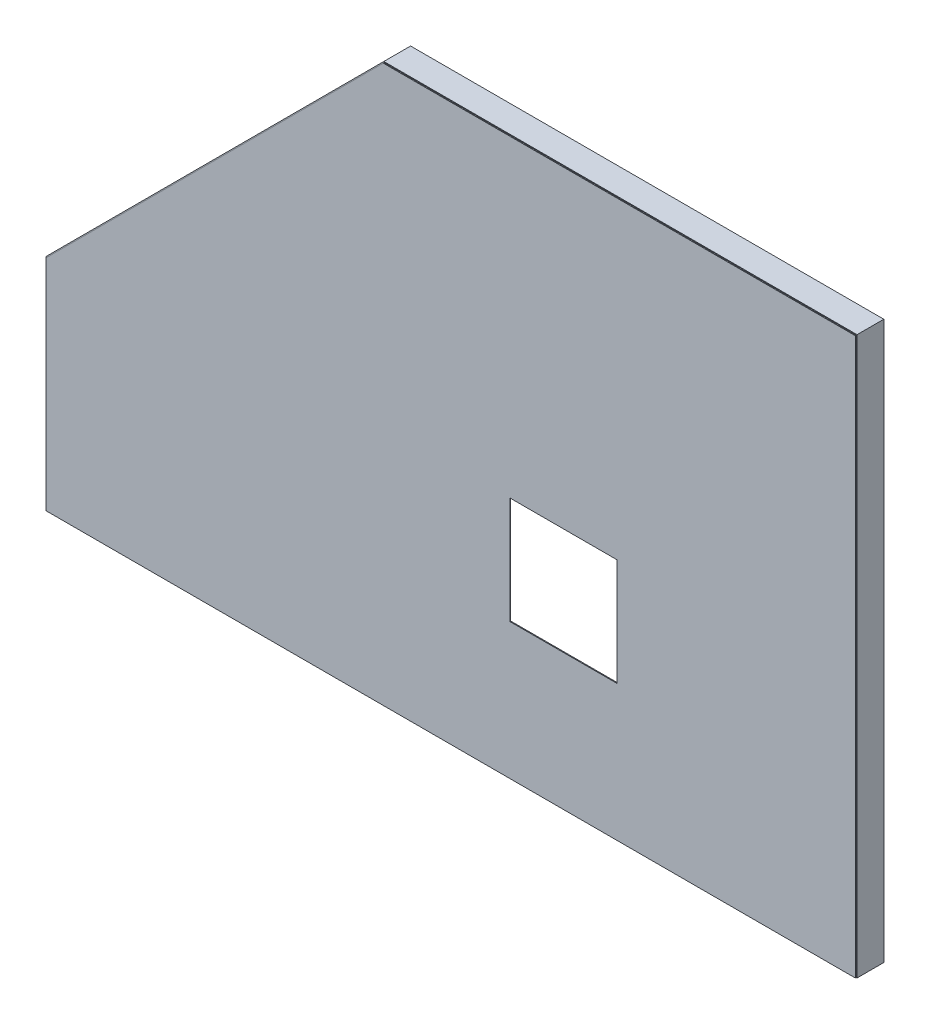
ISO-10303-21;
HEADER;
FILE_DESCRIPTION(('STEP AP214'),'2;1');
FILE_NAME('part.step','',(''),(''),'','','');
FILE_SCHEMA(('AUTOMOTIVE_DESIGN { 1 0 10303 214 1 1 1 1 }'));
ENDSEC;
DATA;
#1=APPLICATION_CONTEXT('core data for automotive mechanical design processes');
#2=APPLICATION_PROTOCOL_DEFINITION('international standard','automotive_design',2000,#1);
#3=PRODUCT_CONTEXT('',#1,'mechanical');
#4=PRODUCT('Part','Part','',(#3));
#5=PRODUCT_RELATED_PRODUCT_CATEGORY('part','',(#4));
#6=PRODUCT_DEFINITION_FORMATION('','',#4);
#7=PRODUCT_DEFINITION_CONTEXT('part definition',#1,'design');
#8=PRODUCT_DEFINITION('design','',#6,#7);
#9=PRODUCT_DEFINITION_SHAPE('','',#8);
#10=(LENGTH_UNIT() NAMED_UNIT(*) SI_UNIT(.MILLI.,.METRE.));
#11=(NAMED_UNIT(*) PLANE_ANGLE_UNIT() SI_UNIT($,.RADIAN.));
#12=(NAMED_UNIT(*) SI_UNIT($,.STERADIAN.) SOLID_ANGLE_UNIT());
#13=UNCERTAINTY_MEASURE_WITH_UNIT(LENGTH_MEASURE(1.E-05),#10,'distance_accuracy_value','');
#14=(GEOMETRIC_REPRESENTATION_CONTEXT(3) GLOBAL_UNCERTAINTY_ASSIGNED_CONTEXT((#13)) GLOBAL_UNIT_ASSIGNED_CONTEXT((#10,
#11,#12)) REPRESENTATION_CONTEXT('',''));
#15=CARTESIAN_POINT('',(0.,0.,0.));
#16=DIRECTION('',(0.,0.,1.));
#17=DIRECTION('',(1.,0.,0.));
#18=AXIS2_PLACEMENT_3D('',#15,#16,#17);
#19=CARTESIAN_POINT('',(0.,0.,-25.4));
#20=DIRECTION('',(-1.,0.,0.));
#21=DIRECTION('',(0.,-1.,0.));
#22=AXIS2_PLACEMENT_3D('',#19,#20,#21);
#23=PLANE('',#22);
#24=DIRECTION('',(0.,-1.,0.));
#25=VECTOR('',#24,1.);
#26=CARTESIAN_POINT('',(0.,0.,0.));
#27=LINE('',#26,#25);
#28=CARTESIAN_POINT('',(0.,208.,0.));
#29=VERTEX_POINT('',#28);
#30=CARTESIAN_POINT('',(0.,0.,0.));
#31=VERTEX_POINT('',#30);
#32=EDGE_CURVE('E160',#29,#31,#27,.T.);
#33=ORIENTED_EDGE('',*,*,#32,.T.);
#34=DIRECTION('',(0.,0.,1.));
#35=VECTOR('',#34,1.);
#36=CARTESIAN_POINT('',(0.,0.,-25.4));
#37=LINE('',#36,#35);
#38=CARTESIAN_POINT('',(0.,0.,-25.4));
#39=VERTEX_POINT('',#38);
#40=EDGE_CURVE('E12',#39,#31,#37,.T.);
#41=ORIENTED_EDGE('',*,*,#40,.F.);
#42=DIRECTION('',(0.,-1.,0.));
#43=VECTOR('',#42,1.);
#44=CARTESIAN_POINT('',(0.,0.,-25.4));
#45=LINE('',#44,#43);
#46=CARTESIAN_POINT('',(0.,208.,-25.4));
#47=VERTEX_POINT('',#46);
#48=EDGE_CURVE('E178',#47,#39,#45,.T.);
#49=ORIENTED_EDGE('',*,*,#48,.F.);
#50=DIRECTION('',(0.,0.,1.));
#51=VECTOR('',#50,1.);
#52=CARTESIAN_POINT('',(0.,208.,-25.4));
#53=LINE('',#52,#51);
#54=EDGE_CURVE('E156',#47,#29,#53,.T.);
#55=ORIENTED_EDGE('',*,*,#54,.T.);
#56=EDGE_LOOP('',(#33,#41,#49,#55));
#57=FACE_BOUND('',#56,.T.);
#58=ADVANCED_FACE('F52',(#57),#23,.F.);
#59=CARTESIAN_POINT('',(-0.83566,0.,-25.4));
#60=DIRECTION('',(0.,1.,0.));
#61=DIRECTION('',(0.,0.,1.));
#62=AXIS2_PLACEMENT_3D('',#59,#60,#61);
#63=PLANE('',#62);
#64=DIRECTION('',(-1.,0.,0.));
#65=VECTOR('',#64,1.);
#66=CARTESIAN_POINT('',(-0.83566,0.,0.));
#67=LINE('',#66,#65);
#68=CARTESIAN_POINT('',(-0.83566,0.,0.));
#69=VERTEX_POINT('',#68);
#70=EDGE_CURVE('E163',#31,#69,#67,.T.);
#71=ORIENTED_EDGE('',*,*,#70,.T.);
#72=DIRECTION('',(0.,0.,1.));
#73=VECTOR('',#72,1.);
#74=CARTESIAN_POINT('',(-0.83566,0.,-25.4));
#75=LINE('',#74,#73);
#76=CARTESIAN_POINT('',(-0.83566,0.,-25.4));
#77=VERTEX_POINT('',#76);
#78=EDGE_CURVE('E60',#77,#69,#75,.T.);
#79=ORIENTED_EDGE('',*,*,#78,.F.);
#80=DIRECTION('',(-1.,0.,0.));
#81=VECTOR('',#80,1.);
#82=CARTESIAN_POINT('',(-0.83566,0.,-25.4));
#83=LINE('',#82,#81);
#84=EDGE_CURVE('E117',#39,#77,#83,.T.);
#85=ORIENTED_EDGE('',*,*,#84,.F.);
#86=ORIENTED_EDGE('',*,*,#40,.T.);
#87=EDGE_LOOP('',(#71,#79,#85,#86));
#88=FACE_BOUND('',#87,.T.);
#89=ADVANCED_FACE('F227',(#88),#63,.F.);
#90=CARTESIAN_POINT('',(-0.83566,0.,-25.4));
#91=DIRECTION('',(1.,0.,0.));
#92=DIRECTION('',(0.,1.,0.));
#93=AXIS2_PLACEMENT_3D('',#90,#91,#92);
#94=PLANE('',#93);
#95=DIRECTION('',(0.,1.,0.));
#96=VECTOR('',#95,1.);
#97=CARTESIAN_POINT('',(-0.83566,0.,0.));
#98=LINE('',#97,#96);
#99=CARTESIAN_POINT('',(-0.83566,208.346141705533,0.));
#100=VERTEX_POINT('',#99);
#101=EDGE_CURVE('E165',#69,#100,#98,.T.);
#102=ORIENTED_EDGE('',*,*,#101,.T.);
#103=DIRECTION('',(0.,0.,1.));
#104=VECTOR('',#103,1.);
#105=CARTESIAN_POINT('',(-0.83566,208.346141705533,-25.4));
#106=LINE('',#105,#104);
#107=CARTESIAN_POINT('',(-0.83566,208.346141705533,-25.4));
#108=VERTEX_POINT('',#107);
#109=EDGE_CURVE('E191',#108,#100,#106,.T.);
#110=ORIENTED_EDGE('',*,*,#109,.F.);
#111=DIRECTION('',(0.,1.,0.));
#112=VECTOR('',#111,1.);
#113=CARTESIAN_POINT('',(-0.83566,0.,-25.4));
#114=LINE('',#113,#112);
#115=EDGE_CURVE('E199',#77,#108,#114,.T.);
#116=ORIENTED_EDGE('',*,*,#115,.F.);
#117=ORIENTED_EDGE('',*,*,#78,.T.);
#118=EDGE_LOOP('',(#102,#110,#116,#117));
#119=FACE_BOUND('',#118,.T.);
#120=ADVANCED_FACE('F197',(#119),#94,.F.);
#121=CARTESIAN_POINT('',(-0.83566,208.346141705533,-25.4));
#122=DIRECTION('',(0.707106781186548,-0.707106781186547,0.));
#123=DIRECTION('',(0.707106781186547,0.707106781186548,0.));
#124=AXIS2_PLACEMENT_3D('',#121,#122,#123);
#125=PLANE('',#124);
#126=DIRECTION('',(0.707106781186547,0.707106781186548,0.));
#127=VECTOR('',#126,1.);
#128=CARTESIAN_POINT('',(-0.83566,208.346141705533,0.));
#129=LINE('',#128,#127);
#130=CARTESIAN_POINT('',(319.653858294467,528.83566,0.));
#131=VERTEX_POINT('',#130);
#132=EDGE_CURVE('E167',#100,#131,#129,.T.);
#133=ORIENTED_EDGE('',*,*,#132,.T.);
#134=DIRECTION('',(0.,0.,1.));
#135=VECTOR('',#134,1.);
#136=CARTESIAN_POINT('',(319.653858294467,528.83566,-25.4));
#137=LINE('',#136,#135);
#138=CARTESIAN_POINT('',(319.653858294467,528.83566,-25.4));
#139=VERTEX_POINT('',#138);
#140=EDGE_CURVE('E188',#139,#131,#137,.T.);
#141=ORIENTED_EDGE('',*,*,#140,.F.);
#142=DIRECTION('',(0.707106781186547,0.707106781186548,0.));
#143=VECTOR('',#142,1.);
#144=CARTESIAN_POINT('',(-0.83566,208.346141705533,-25.4));
#145=LINE('',#144,#143);
#146=EDGE_CURVE('E217',#108,#139,#145,.T.);
#147=ORIENTED_EDGE('',*,*,#146,.F.);
#148=ORIENTED_EDGE('',*,*,#109,.T.);
#149=EDGE_LOOP('',(#133,#141,#147,#148));
#150=FACE_BOUND('',#149,.T.);
#151=ADVANCED_FACE('F208',(#150),#125,.F.);
#152=CARTESIAN_POINT('',(319.653858294467,528.83566,-25.4));
#153=DIRECTION('',(0.,-1.,0.));
#154=DIRECTION('',(1.,0.,0.));
#155=AXIS2_PLACEMENT_3D('',#152,#153,#154);
#156=PLANE('',#155);
#157=DIRECTION('',(1.,0.,0.));
#158=VECTOR('',#157,1.);
#159=CARTESIAN_POINT('',(319.653858294467,528.83566,0.));
#160=LINE('',#159,#158);
#161=CARTESIAN_POINT('',(768.83566,528.83566,0.));
#162=VERTEX_POINT('',#161);
#163=EDGE_CURVE('E169',#131,#162,#160,.T.);
#164=ORIENTED_EDGE('',*,*,#163,.T.);
#165=DIRECTION('',(0.,0.,1.));
#166=VECTOR('',#165,1.);
#167=CARTESIAN_POINT('',(768.83566,528.83566,-25.4));
#168=LINE('',#167,#166);
#169=CARTESIAN_POINT('',(768.83566,528.83566,-25.4));
#170=VERTEX_POINT('',#169);
#171=EDGE_CURVE('E185',#170,#162,#168,.T.);
#172=ORIENTED_EDGE('',*,*,#171,.F.);
#173=DIRECTION('',(1.,0.,0.));
#174=VECTOR('',#173,1.);
#175=CARTESIAN_POINT('',(319.653858294467,528.83566,-25.4));
#176=LINE('',#175,#174);
#177=EDGE_CURVE('E214',#139,#170,#176,.T.);
#178=ORIENTED_EDGE('',*,*,#177,.F.);
#179=ORIENTED_EDGE('',*,*,#140,.T.);
#180=EDGE_LOOP('',(#164,#172,#178,#179));
#181=FACE_BOUND('',#180,.T.);
#182=ADVANCED_FACE('F212',(#181),#156,.F.);
#183=CARTESIAN_POINT('',(768.83566,528.83566,-25.4));
#184=DIRECTION('',(-1.,0.,0.));
#185=DIRECTION('',(0.,-1.,0.));
#186=AXIS2_PLACEMENT_3D('',#183,#184,#185);
#187=PLANE('',#186);
#188=DIRECTION('',(0.,-1.,0.));
#189=VECTOR('',#188,1.);
#190=CARTESIAN_POINT('',(768.83566,528.83566,0.));
#191=LINE('',#190,#189);
#192=CARTESIAN_POINT('',(768.83566,0.,0.));
#193=VERTEX_POINT('',#192);
#194=EDGE_CURVE('E171',#162,#193,#191,.T.);
#195=ORIENTED_EDGE('',*,*,#194,.T.);
#196=DIRECTION('',(0.,0.,1.));
#197=VECTOR('',#196,1.);
#198=CARTESIAN_POINT('',(768.83566,0.,-25.4));
#199=LINE('',#198,#197);
#200=CARTESIAN_POINT('',(768.83566,0.,-25.4));
#201=VERTEX_POINT('',#200);
#202=EDGE_CURVE('E182',#201,#193,#199,.T.);
#203=ORIENTED_EDGE('',*,*,#202,.F.);
#204=DIRECTION('',(0.,-1.,0.));
#205=VECTOR('',#204,1.);
#206=CARTESIAN_POINT('',(768.83566,528.83566,-25.4));
#207=LINE('',#206,#205);
#208=EDGE_CURVE('E216',#170,#201,#207,.T.);
#209=ORIENTED_EDGE('',*,*,#208,.F.);
#210=ORIENTED_EDGE('',*,*,#171,.T.);
#211=EDGE_LOOP('',(#195,#203,#209,#210));
#212=FACE_BOUND('',#211,.T.);
#213=ADVANCED_FACE('F239',(#212),#187,.F.);
#214=CARTESIAN_POINT('',(768.83566,0.,-25.4));
#215=DIRECTION('',(0.,1.,0.));
#216=DIRECTION('',(-1.,0.,0.));
#217=AXIS2_PLACEMENT_3D('',#214,#215,#216);
#218=PLANE('',#217);
#219=DIRECTION('',(-1.,0.,0.));
#220=VECTOR('',#219,1.);
#221=CARTESIAN_POINT('',(768.83566,0.,0.));
#222=LINE('',#221,#220);
#223=CARTESIAN_POINT('',(768.,0.,0.));
#224=VERTEX_POINT('',#223);
#225=EDGE_CURVE('E173',#193,#224,#222,.T.);
#226=ORIENTED_EDGE('',*,*,#225,.T.);
#227=DIRECTION('',(0.,0.,1.));
#228=VECTOR('',#227,1.);
#229=CARTESIAN_POINT('',(768.,0.,-25.4));
#230=LINE('',#229,#228);
#231=CARTESIAN_POINT('',(768.,0.,-25.4));
#232=VERTEX_POINT('',#231);
#233=EDGE_CURVE('E151',#232,#224,#230,.T.);
#234=ORIENTED_EDGE('',*,*,#233,.F.);
#235=DIRECTION('',(-1.,0.,0.));
#236=VECTOR('',#235,1.);
#237=CARTESIAN_POINT('',(768.83566,0.,-25.4));
#238=LINE('',#237,#236);
#239=EDGE_CURVE('E142',#201,#232,#238,.T.);
#240=ORIENTED_EDGE('',*,*,#239,.F.);
#241=ORIENTED_EDGE('',*,*,#202,.T.);
#242=EDGE_LOOP('',(#226,#234,#240,#241));
#243=FACE_BOUND('',#242,.T.);
#244=ADVANCED_FACE('F242',(#243),#218,.F.);
#245=CARTESIAN_POINT('',(768.,528.,-25.4));
#246=DIRECTION('',(1.,0.,0.));
#247=DIRECTION('',(0.,0.,-1.));
#248=AXIS2_PLACEMENT_3D('',#245,#246,#247);
#249=PLANE('',#248);
#250=DIRECTION('',(0.,1.,0.));
#251=VECTOR('',#250,1.);
#252=CARTESIAN_POINT('',(768.,528.,0.));
#253=LINE('',#252,#251);
#254=CARTESIAN_POINT('',(768.,528.,0.));
#255=VERTEX_POINT('',#254);
#256=EDGE_CURVE('E150',#224,#255,#253,.T.);
#257=ORIENTED_EDGE('',*,*,#256,.T.);
#258=DIRECTION('',(0.,0.,1.));
#259=VECTOR('',#258,1.);
#260=CARTESIAN_POINT('',(768.,528.,-25.4));
#261=LINE('',#260,#259);
#262=CARTESIAN_POINT('',(768.,528.,-25.4));
#263=VERTEX_POINT('',#262);
#264=EDGE_CURVE('E147',#263,#255,#261,.T.);
#265=ORIENTED_EDGE('',*,*,#264,.F.);
#266=DIRECTION('',(0.,1.,0.));
#267=VECTOR('',#266,1.);
#268=CARTESIAN_POINT('',(768.,528.,-25.4));
#269=LINE('',#268,#267);
#270=EDGE_CURVE('E136',#232,#263,#269,.T.);
#271=ORIENTED_EDGE('',*,*,#270,.F.);
#272=ORIENTED_EDGE('',*,*,#233,.T.);
#273=EDGE_LOOP('',(#257,#265,#271,#272));
#274=FACE_BOUND('',#273,.T.);
#275=ADVANCED_FACE('F148',(#274),#249,.F.);
#276=CARTESIAN_POINT('',(320.,528.,-25.4));
#277=DIRECTION('',(0.,1.,0.));
#278=DIRECTION('',(-1.,0.,0.));
#279=AXIS2_PLACEMENT_3D('',#276,#277,#278);
#280=PLANE('',#279);
#281=DIRECTION('',(-1.,0.,0.));
#282=VECTOR('',#281,1.);
#283=CARTESIAN_POINT('',(320.,528.,0.));
#284=LINE('',#283,#282);
#285=CARTESIAN_POINT('',(320.,528.,0.));
#286=VERTEX_POINT('',#285);
#287=EDGE_CURVE('E103',#255,#286,#284,.T.);
#288=ORIENTED_EDGE('',*,*,#287,.T.);
#289=DIRECTION('',(0.,0.,1.));
#290=VECTOR('',#289,1.);
#291=CARTESIAN_POINT('',(320.,528.,-25.4));
#292=LINE('',#291,#290);
#293=CARTESIAN_POINT('',(320.,528.,-25.4));
#294=VERTEX_POINT('',#293);
#295=EDGE_CURVE('E152',#294,#286,#292,.T.);
#296=ORIENTED_EDGE('',*,*,#295,.F.);
#297=DIRECTION('',(-1.,0.,0.));
#298=VECTOR('',#297,1.);
#299=CARTESIAN_POINT('',(320.,528.,-25.4));
#300=LINE('',#299,#298);
#301=EDGE_CURVE('E140',#263,#294,#300,.T.);
#302=ORIENTED_EDGE('',*,*,#301,.F.);
#303=ORIENTED_EDGE('',*,*,#264,.T.);
#304=EDGE_LOOP('',(#288,#296,#302,#303));
#305=FACE_BOUND('',#304,.T.);
#306=ADVANCED_FACE('F154',(#305),#280,.F.);
#307=CARTESIAN_POINT('',(0.,208.,-25.4));
#308=DIRECTION('',(-0.707106781186548,0.707106781186547,0.));
#309=DIRECTION('',(-0.707106781186547,-0.707106781186548,0.));
#310=AXIS2_PLACEMENT_3D('',#307,#308,#309);
#311=PLANE('',#310);
#312=DIRECTION('',(-0.707106781186547,-0.707106781186548,0.));
#313=VECTOR('',#312,1.);
#314=CARTESIAN_POINT('',(0.,208.,0.));
#315=LINE('',#314,#313);
#316=EDGE_CURVE('E109',#286,#29,#315,.T.);
#317=ORIENTED_EDGE('',*,*,#316,.T.);
#318=ORIENTED_EDGE('',*,*,#54,.F.);
#319=DIRECTION('',(-0.707106781186547,-0.707106781186548,0.));
#320=VECTOR('',#319,1.);
#321=CARTESIAN_POINT('',(0.,208.,-25.4));
#322=LINE('',#321,#320);
#323=EDGE_CURVE('E68',#294,#47,#322,.T.);
#324=ORIENTED_EDGE('',*,*,#323,.F.);
#325=ORIENTED_EDGE('',*,*,#295,.T.);
#326=EDGE_LOOP('',(#317,#318,#324,#325));
#327=FACE_BOUND('',#326,.T.);
#328=ADVANCED_FACE('F251',(#327),#311,.F.);
#329=CARTESIAN_POINT('',(0.,0.,-25.4));
#330=DIRECTION('',(0.,0.,-1.));
#331=DIRECTION('',(-1.,0.,0.));
#332=AXIS2_PLACEMENT_3D('',#329,#330,#331);
#333=PLANE('',#332);
#334=ORIENTED_EDGE('',*,*,#48,.T.);
#335=ORIENTED_EDGE('',*,*,#84,.T.);
#336=ORIENTED_EDGE('',*,*,#115,.T.);
#337=ORIENTED_EDGE('',*,*,#146,.T.);
#338=ORIENTED_EDGE('',*,*,#177,.T.);
#339=ORIENTED_EDGE('',*,*,#208,.T.);
#340=ORIENTED_EDGE('',*,*,#239,.T.);
#341=ORIENTED_EDGE('',*,*,#270,.T.);
#342=ORIENTED_EDGE('',*,*,#301,.T.);
#343=ORIENTED_EDGE('',*,*,#323,.T.);
#344=EDGE_LOOP('',(#334,#335,#336,#337,#338,#339,#340,#341,#342,#343));
#345=FACE_BOUND('',#344,.T.);
#346=ADVANCED_FACE('F138',(#345),#333,.T.);
#347=CARTESIAN_POINT('',(0.,0.,0.));
#348=DIRECTION('',(0.,0.,-1.));
#349=DIRECTION('',(-1.,0.,0.));
#350=AXIS2_PLACEMENT_3D('',#347,#348,#349);
#351=PLANE('',#350);
#352=ORIENTED_EDGE('',*,*,#32,.F.);
#353=ORIENTED_EDGE('',*,*,#316,.F.);
#354=ORIENTED_EDGE('',*,*,#287,.F.);
#355=ORIENTED_EDGE('',*,*,#256,.F.);
#356=ORIENTED_EDGE('',*,*,#225,.F.);
#357=ORIENTED_EDGE('',*,*,#194,.F.);
#358=ORIENTED_EDGE('',*,*,#163,.F.);
#359=ORIENTED_EDGE('',*,*,#132,.F.);
#360=ORIENTED_EDGE('',*,*,#101,.F.);
#361=ORIENTED_EDGE('',*,*,#70,.F.);
#362=EDGE_LOOP('',(#352,#353,#354,#355,#356,#357,#358,#359,#360,#361));
#363=FACE_BOUND('',#362,.T.);
#364=ADVANCED_FACE('F203',(#363),#351,.F.);
#365=CLOSED_SHELL('',(#58,#89,#120,#151,#182,#213,#244,#275,#306,#328,#346,#364));
#366=MANIFOLD_SOLID_BREP('B2',#365);
#367=CARTESIAN_POINT('',(0.,208.,0.83566));
#368=DIRECTION('',(1.,0.,0.));
#369=DIRECTION('',(0.,1.,0.));
#370=AXIS2_PLACEMENT_3D('',#367,#368,#369);
#371=PLANE('',#370);
#372=DIRECTION('',(0.,-1.,0.));
#373=VECTOR('',#372,1.);
#374=CARTESIAN_POINT('',(0.,208.,0.));
#375=LINE('',#374,#373);
#376=CARTESIAN_POINT('',(0.,208.,0.));
#377=VERTEX_POINT('',#376);
#378=CARTESIAN_POINT('',(0.,0.,0.));
#379=VERTEX_POINT('',#378);
#380=EDGE_CURVE('E457',#377,#379,#375,.T.);
#381=ORIENTED_EDGE('',*,*,#380,.T.);
#382=DIRECTION('',(0.,0.,-1.));
#383=VECTOR('',#382,1.);
#384=CARTESIAN_POINT('',(0.,0.,0.83566));
#385=LINE('',#384,#383);
#386=CARTESIAN_POINT('',(0.,0.,0.83566));
#387=VERTEX_POINT('',#386);
#388=EDGE_CURVE('E509',#387,#379,#385,.T.);
#389=ORIENTED_EDGE('',*,*,#388,.F.);
#390=DIRECTION('',(0.,-1.,0.));
#391=VECTOR('',#390,1.);
#392=CARTESIAN_POINT('',(0.,208.,0.83566));
#393=LINE('',#392,#391);
#394=CARTESIAN_POINT('',(0.,208.,0.83566));
#395=VERTEX_POINT('',#394);
#396=EDGE_CURVE('E462',#395,#387,#393,.T.);
#397=ORIENTED_EDGE('',*,*,#396,.F.);
#398=DIRECTION('',(0.,0.,-1.));
#399=VECTOR('',#398,1.);
#400=CARTESIAN_POINT('',(0.,208.,0.83566));
#401=LINE('',#400,#399);
#402=EDGE_CURVE('E479',#395,#377,#401,.T.);
#403=ORIENTED_EDGE('',*,*,#402,.T.);
#404=EDGE_LOOP('',(#381,#389,#397,#403));
#405=FACE_BOUND('',#404,.T.);
#406=ADVANCED_FACE('F355',(#405),#371,.F.);
#407=CARTESIAN_POINT('',(0.,0.,0.83566));
#408=DIRECTION('',(0.,1.,0.));
#409=DIRECTION('',(0.,0.,1.));
#410=AXIS2_PLACEMENT_3D('',#407,#408,#409);
#411=PLANE('',#410);
#412=DIRECTION('',(1.,0.,0.));
#413=VECTOR('',#412,1.);
#414=CARTESIAN_POINT('',(0.,0.,0.));
#415=LINE('',#414,#413);
#416=CARTESIAN_POINT('',(768.,0.,0.));
#417=VERTEX_POINT('',#416);
#418=EDGE_CURVE('E483',#379,#417,#415,.T.);
#419=ORIENTED_EDGE('',*,*,#418,.T.);
#420=DIRECTION('',(0.,0.,-1.));
#421=VECTOR('',#420,1.);
#422=CARTESIAN_POINT('',(768.,0.,0.83566));
#423=LINE('',#422,#421);
#424=CARTESIAN_POINT('',(768.,0.,0.83566));
#425=VERTEX_POINT('',#424);
#426=EDGE_CURVE('E505',#425,#417,#423,.T.);
#427=ORIENTED_EDGE('',*,*,#426,.F.);
#428=DIRECTION('',(1.,0.,0.));
#429=VECTOR('',#428,1.);
#430=CARTESIAN_POINT('',(0.,0.,0.83566));
#431=LINE('',#430,#429);
#432=EDGE_CURVE('E466',#387,#425,#431,.T.);
#433=ORIENTED_EDGE('',*,*,#432,.F.);
#434=ORIENTED_EDGE('',*,*,#388,.T.);
#435=EDGE_LOOP('',(#419,#427,#433,#434));
#436=FACE_BOUND('',#435,.T.);
#437=ADVANCED_FACE('F537',(#436),#411,.F.);
#438=CARTESIAN_POINT('',(768.,0.,0.83566));
#439=DIRECTION('',(-1.,0.,0.));
#440=DIRECTION('',(0.,0.,1.));
#441=AXIS2_PLACEMENT_3D('',#438,#439,#440);
#442=PLANE('',#441);
#443=DIRECTION('',(0.,1.,0.));
#444=VECTOR('',#443,1.);
#445=CARTESIAN_POINT('',(768.,0.,0.));
#446=LINE('',#445,#444);
#447=CARTESIAN_POINT('',(768.,528.,0.));
#448=VERTEX_POINT('',#447);
#449=EDGE_CURVE('E486',#417,#448,#446,.T.);
#450=ORIENTED_EDGE('',*,*,#449,.T.);
#451=DIRECTION('',(0.,0.,-1.));
#452=VECTOR('',#451,1.);
#453=CARTESIAN_POINT('',(768.,528.,0.83566));
#454=LINE('',#453,#452);
#455=CARTESIAN_POINT('',(768.,528.,0.83566));
#456=VERTEX_POINT('',#455);
#457=EDGE_CURVE('E501',#456,#448,#454,.T.);
#458=ORIENTED_EDGE('',*,*,#457,.F.);
#459=DIRECTION('',(0.,1.,0.));
#460=VECTOR('',#459,1.);
#461=CARTESIAN_POINT('',(768.,0.,0.83566));
#462=LINE('',#461,#460);
#463=EDGE_CURVE('E470',#425,#456,#462,.T.);
#464=ORIENTED_EDGE('',*,*,#463,.F.);
#465=ORIENTED_EDGE('',*,*,#426,.T.);
#466=EDGE_LOOP('',(#450,#458,#464,#465));
#467=FACE_BOUND('',#466,.T.);
#468=ADVANCED_FACE('F542',(#467),#442,.F.);
#469=CARTESIAN_POINT('',(768.,528.,0.83566));
#470=DIRECTION('',(0.,-1.,0.));
#471=DIRECTION('',(1.,0.,0.));
#472=AXIS2_PLACEMENT_3D('',#469,#470,#471);
#473=PLANE('',#472);
#474=DIRECTION('',(-1.,0.,0.));
#475=VECTOR('',#474,1.);
#476=CARTESIAN_POINT('',(768.,528.,0.));
#477=LINE('',#476,#475);
#478=CARTESIAN_POINT('',(320.,528.,0.));
#479=VERTEX_POINT('',#478);
#480=EDGE_CURVE('E489',#448,#479,#477,.T.);
#481=ORIENTED_EDGE('',*,*,#480,.T.);
#482=DIRECTION('',(0.,0.,-1.));
#483=VECTOR('',#482,1.);
#484=CARTESIAN_POINT('',(320.,528.,0.83566));
#485=LINE('',#484,#483);
#486=CARTESIAN_POINT('',(320.,528.,0.83566));
#487=VERTEX_POINT('',#486);
#488=EDGE_CURVE('E497',#487,#479,#485,.T.);
#489=ORIENTED_EDGE('',*,*,#488,.F.);
#490=DIRECTION('',(-1.,0.,0.));
#491=VECTOR('',#490,1.);
#492=CARTESIAN_POINT('',(768.,528.,0.83566));
#493=LINE('',#492,#491);
#494=EDGE_CURVE('E473',#456,#487,#493,.T.);
#495=ORIENTED_EDGE('',*,*,#494,.F.);
#496=ORIENTED_EDGE('',*,*,#457,.T.);
#497=EDGE_LOOP('',(#481,#489,#495,#496));
#498=FACE_BOUND('',#497,.T.);
#499=ADVANCED_FACE('F559',(#498),#473,.F.);
#500=CARTESIAN_POINT('',(320.,528.,0.83566));
#501=DIRECTION('',(0.707106781186548,-0.707106781186547,0.));
#502=DIRECTION('',(0.707106781186547,0.707106781186548,0.));
#503=AXIS2_PLACEMENT_3D('',#500,#501,#502);
#504=PLANE('',#503);
#505=DIRECTION('',(-0.707106781186547,-0.707106781186548,0.));
#506=VECTOR('',#505,1.);
#507=CARTESIAN_POINT('',(320.,528.,0.));
#508=LINE('',#507,#506);
#509=EDGE_CURVE('E467',#479,#377,#508,.T.);
#510=ORIENTED_EDGE('',*,*,#509,.T.);
#511=ORIENTED_EDGE('',*,*,#402,.F.);
#512=DIRECTION('',(-0.707106781186547,-0.707106781186548,0.));
#513=VECTOR('',#512,1.);
#514=CARTESIAN_POINT('',(320.,528.,0.83566));
#515=LINE('',#514,#513);
#516=EDGE_CURVE('E476',#487,#395,#515,.T.);
#517=ORIENTED_EDGE('',*,*,#516,.F.);
#518=ORIENTED_EDGE('',*,*,#488,.T.);
#519=EDGE_LOOP('',(#510,#511,#517,#518));
#520=FACE_BOUND('',#519,.T.);
#521=ADVANCED_FACE('F557',(#520),#504,.F.);
#522=CARTESIAN_POINT('',(0.,0.,0.83566));
#523=DIRECTION('',(0.,0.,1.));
#524=DIRECTION('',(1.,0.,0.));
#525=AXIS2_PLACEMENT_3D('',#522,#523,#524);
#526=PLANE('',#525);
#527=DIRECTION('',(0.,-1.,0.));
#528=VECTOR('',#527,1.);
#529=CARTESIAN_POINT('',(440.039276622487,129.077007981509,0.83566));
#530=LINE('',#529,#528);
#531=CARTESIAN_POINT('',(440.039276622487,230.677007981509,0.83566));
#532=VERTEX_POINT('',#531);
#533=CARTESIAN_POINT('',(440.039276622487,129.077007981509,0.83566));
#534=VERTEX_POINT('',#533);
#535=EDGE_CURVE('E370',#532,#534,#530,.T.);
#536=ORIENTED_EDGE('',*,*,#535,.F.);
#537=DIRECTION('',(-1.,0.,0.));
#538=VECTOR('',#537,1.);
#539=CARTESIAN_POINT('',(440.039276622487,230.677007981509,0.83566));
#540=LINE('',#539,#538);
#541=CARTESIAN_POINT('',(541.639276622487,230.677007981509,0.83566));
#542=VERTEX_POINT('',#541);
#543=EDGE_CURVE('E447',#542,#532,#540,.T.);
#544=ORIENTED_EDGE('',*,*,#543,.F.);
#545=DIRECTION('',(0.,1.,0.));
#546=VECTOR('',#545,1.);
#547=CARTESIAN_POINT('',(541.639276622487,129.077007981509,0.83566));
#548=LINE('',#547,#546);
#549=CARTESIAN_POINT('',(541.639276622487,129.077007981509,0.83566));
#550=VERTEX_POINT('',#549);
#551=EDGE_CURVE('E429',#550,#542,#548,.T.);
#552=ORIENTED_EDGE('',*,*,#551,.F.);
#553=DIRECTION('',(1.,0.,0.));
#554=VECTOR('',#553,1.);
#555=CARTESIAN_POINT('',(440.039276622487,129.077007981509,0.83566));
#556=LINE('',#555,#554);
#557=EDGE_CURVE('E439',#534,#550,#556,.T.);
#558=ORIENTED_EDGE('',*,*,#557,.F.);
#559=EDGE_LOOP('',(#536,#544,#552,#558));
#560=FACE_BOUND('',#559,.T.);
#561=ORIENTED_EDGE('',*,*,#396,.T.);
#562=ORIENTED_EDGE('',*,*,#432,.T.);
#563=ORIENTED_EDGE('',*,*,#463,.T.);
#564=ORIENTED_EDGE('',*,*,#494,.T.);
#565=ORIENTED_EDGE('',*,*,#516,.T.);
#566=EDGE_LOOP('',(#561,#562,#563,#564,#565));
#567=FACE_BOUND('',#566,.T.);
#568=ADVANCED_FACE('F444',(#560,#567),#526,.T.);
#569=CARTESIAN_POINT('',(0.,0.,0.));
#570=DIRECTION('',(0.,0.,1.));
#571=DIRECTION('',(1.,0.,0.));
#572=AXIS2_PLACEMENT_3D('',#569,#570,#571);
#573=PLANE('',#572);
#574=DIRECTION('',(-1.,0.,0.));
#575=VECTOR('',#574,1.);
#576=CARTESIAN_POINT('',(0.,230.677007981509,0.));
#577=LINE('',#576,#575);
#578=CARTESIAN_POINT('',(541.639276622487,230.677007981509,0.));
#579=VERTEX_POINT('',#578);
#580=CARTESIAN_POINT('',(440.039276622487,230.677007981509,0.));
#581=VERTEX_POINT('',#580);
#582=EDGE_CURVE('E363',#579,#581,#577,.T.);
#583=ORIENTED_EDGE('',*,*,#582,.T.);
#584=DIRECTION('',(0.,-1.,0.));
#585=VECTOR('',#584,1.);
#586=CARTESIAN_POINT('',(440.039276622487,0.,0.));
#587=LINE('',#586,#585);
#588=CARTESIAN_POINT('',(440.039276622487,129.077007981509,0.));
#589=VERTEX_POINT('',#588);
#590=EDGE_CURVE('E50',#581,#589,#587,.T.);
#591=ORIENTED_EDGE('',*,*,#590,.T.);
#592=DIRECTION('',(1.,0.,0.));
#593=VECTOR('',#592,1.);
#594=CARTESIAN_POINT('',(0.,129.077007981509,0.));
#595=LINE('',#594,#593);
#596=CARTESIAN_POINT('',(541.639276622487,129.077007981509,0.));
#597=VERTEX_POINT('',#596);
#598=EDGE_CURVE('E513',#589,#597,#595,.T.);
#599=ORIENTED_EDGE('',*,*,#598,.T.);
#600=DIRECTION('',(0.,1.,0.));
#601=VECTOR('',#600,1.);
#602=CARTESIAN_POINT('',(541.639276622487,0.,0.));
#603=LINE('',#602,#601);
#604=EDGE_CURVE('E432',#597,#579,#603,.T.);
#605=ORIENTED_EDGE('',*,*,#604,.T.);
#606=EDGE_LOOP('',(#583,#591,#599,#605));
#607=FACE_BOUND('',#606,.T.);
#608=ORIENTED_EDGE('',*,*,#380,.F.);
#609=ORIENTED_EDGE('',*,*,#509,.F.);
#610=ORIENTED_EDGE('',*,*,#480,.F.);
#611=ORIENTED_EDGE('',*,*,#449,.F.);
#612=ORIENTED_EDGE('',*,*,#418,.F.);
#613=EDGE_LOOP('',(#608,#609,#610,#611,#612));
#614=FACE_BOUND('',#613,.T.);
#615=ADVANCED_FACE('F520',(#607,#614),#573,.F.);
#616=CARTESIAN_POINT('',(440.039276622487,129.077007981509,-454.));
#617=DIRECTION('',(-1.,0.,0.));
#618=DIRECTION('',(0.,0.,1.));
#619=AXIS2_PLACEMENT_3D('',#616,#617,#618);
#620=PLANE('',#619);
#621=DIRECTION('',(0.,0.,1.));
#622=VECTOR('',#621,1.);
#623=CARTESIAN_POINT('',(440.039276622487,230.677007981509,-454.));
#624=LINE('',#623,#622);
#625=EDGE_CURVE('E454',#581,#532,#624,.T.);
#626=ORIENTED_EDGE('',*,*,#625,.T.);
#627=ORIENTED_EDGE('',*,*,#535,.T.);
#628=DIRECTION('',(0.,0.,1.));
#629=VECTOR('',#628,1.);
#630=CARTESIAN_POINT('',(440.039276622487,129.077007981509,-454.));
#631=LINE('',#630,#629);
#632=EDGE_CURVE('E436',#589,#534,#631,.T.);
#633=ORIENTED_EDGE('',*,*,#632,.F.);
#634=ORIENTED_EDGE('',*,*,#590,.F.);
#635=EDGE_LOOP('',(#626,#627,#633,#634));
#636=FACE_BOUND('',#635,.T.);
#637=ADVANCED_FACE('F525',(#636),#620,.F.);
#638=CARTESIAN_POINT('',(440.039276622487,230.677007981509,-454.));
#639=DIRECTION('',(0.,1.,0.));
#640=DIRECTION('',(0.,0.,1.));
#641=AXIS2_PLACEMENT_3D('',#638,#639,#640);
#642=PLANE('',#641);
#643=DIRECTION('',(0.,0.,1.));
#644=VECTOR('',#643,1.);
#645=CARTESIAN_POINT('',(541.639276622487,230.677007981509,-454.));
#646=LINE('',#645,#644);
#647=EDGE_CURVE('E435',#579,#542,#646,.T.);
#648=ORIENTED_EDGE('',*,*,#647,.T.);
#649=ORIENTED_EDGE('',*,*,#543,.T.);
#650=ORIENTED_EDGE('',*,*,#625,.F.);
#651=ORIENTED_EDGE('',*,*,#582,.F.);
#652=EDGE_LOOP('',(#648,#649,#650,#651));
#653=FACE_BOUND('',#652,.T.);
#654=ADVANCED_FACE('F524',(#653),#642,.F.);
#655=CARTESIAN_POINT('',(541.639276622487,129.077007981509,-454.));
#656=DIRECTION('',(1.,0.,0.));
#657=DIRECTION('',(0.,0.,-1.));
#658=AXIS2_PLACEMENT_3D('',#655,#656,#657);
#659=PLANE('',#658);
#660=DIRECTION('',(0.,0.,1.));
#661=VECTOR('',#660,1.);
#662=CARTESIAN_POINT('',(541.639276622487,129.077007981509,-454.));
#663=LINE('',#662,#661);
#664=EDGE_CURVE('E378',#597,#550,#663,.T.);
#665=ORIENTED_EDGE('',*,*,#664,.T.);
#666=ORIENTED_EDGE('',*,*,#551,.T.);
#667=ORIENTED_EDGE('',*,*,#647,.F.);
#668=ORIENTED_EDGE('',*,*,#604,.F.);
#669=EDGE_LOOP('',(#665,#666,#667,#668));
#670=FACE_BOUND('',#669,.T.);
#671=ADVANCED_FACE('F426',(#670),#659,.F.);
#672=CARTESIAN_POINT('',(440.039276622487,129.077007981509,-454.));
#673=DIRECTION('',(0.,-1.,0.));
#674=DIRECTION('',(1.,0.,0.));
#675=AXIS2_PLACEMENT_3D('',#672,#673,#674);
#676=PLANE('',#675);
#677=ORIENTED_EDGE('',*,*,#632,.T.);
#678=ORIENTED_EDGE('',*,*,#557,.T.);
#679=ORIENTED_EDGE('',*,*,#664,.F.);
#680=ORIENTED_EDGE('',*,*,#598,.F.);
#681=EDGE_LOOP('',(#677,#678,#679,#680));
#682=FACE_BOUND('',#681,.T.);
#683=ADVANCED_FACE('F440',(#682),#676,.F.);
#684=CLOSED_SHELL('',(#406,#437,#468,#499,#521,#568,#615,#637,#654,#671,#683));
#685=MANIFOLD_SOLID_BREP('B6',#684);
#686=ADVANCED_BREP_SHAPE_REPRESENTATION('',(#18,#366,#685),#14);
#687=SHAPE_DEFINITION_REPRESENTATION(#9,#686);
ENDSEC;
END-ISO-10303-21;
